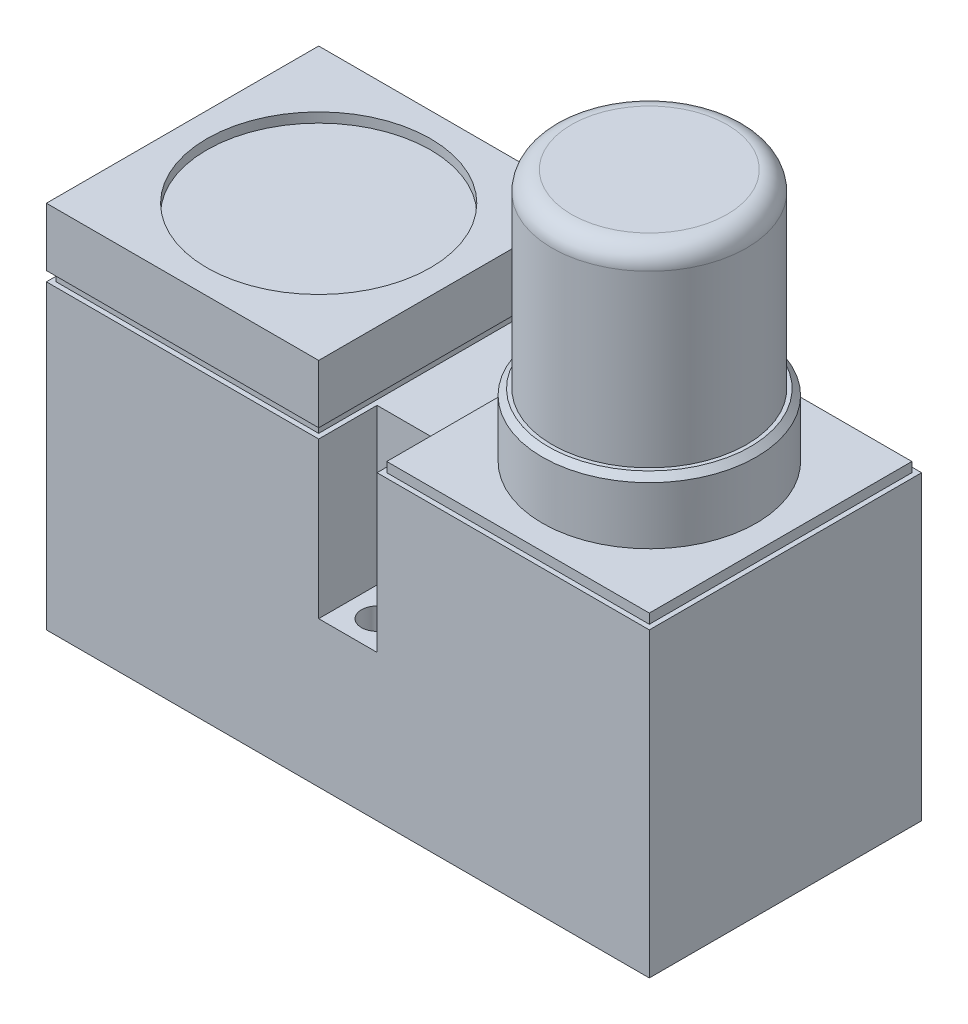
ISO-10303-21;
HEADER;
FILE_DESCRIPTION(('STEP AP214'),'2;1');
FILE_NAME('part.step','',(''),(''),'','','');
FILE_SCHEMA(('AUTOMOTIVE_DESIGN { 1 0 10303 214 1 1 1 1 }'));
ENDSEC;
DATA;
#1=APPLICATION_CONTEXT('core data for automotive mechanical design processes');
#2=APPLICATION_PROTOCOL_DEFINITION('international standard','automotive_design',2000,#1);
#3=PRODUCT_CONTEXT('',#1,'mechanical');
#4=PRODUCT('Part','Part','',(#3));
#5=PRODUCT_RELATED_PRODUCT_CATEGORY('part','',(#4));
#6=PRODUCT_DEFINITION_FORMATION('','',#4);
#7=PRODUCT_DEFINITION_CONTEXT('part definition',#1,'design');
#8=PRODUCT_DEFINITION('design','',#6,#7);
#9=PRODUCT_DEFINITION_SHAPE('','',#8);
#10=(LENGTH_UNIT() NAMED_UNIT(*) SI_UNIT(.MILLI.,.METRE.));
#11=(NAMED_UNIT(*) PLANE_ANGLE_UNIT() SI_UNIT($,.RADIAN.));
#12=(NAMED_UNIT(*) SI_UNIT($,.STERADIAN.) SOLID_ANGLE_UNIT());
#13=UNCERTAINTY_MEASURE_WITH_UNIT(LENGTH_MEASURE(1.E-05),#10,'distance_accuracy_value','');
#14=(GEOMETRIC_REPRESENTATION_CONTEXT(3) GLOBAL_UNCERTAINTY_ASSIGNED_CONTEXT((#13)) GLOBAL_UNIT_ASSIGNED_CONTEXT((#10,
#11,#12)) REPRESENTATION_CONTEXT('',''));
#15=CARTESIAN_POINT('',(0.,0.,0.));
#16=DIRECTION('',(0.,0.,1.));
#17=DIRECTION('',(1.,0.,0.));
#18=AXIS2_PLACEMENT_3D('',#15,#16,#17);
#19=CARTESIAN_POINT('',(-4.,51.,0.));
#20=DIRECTION('',(0.,1.,0.));
#21=DIRECTION('',(0.,0.,1.));
#22=AXIS2_PLACEMENT_3D('',#19,#20,#21);
#23=PLANE('',#22);
#24=CARTESIAN_POINT('',(0.,51.,0.));
#25=DIRECTION('',(0.,-1.,0.));
#26=DIRECTION('',(0.,0.,1.));
#27=AXIS2_PLACEMENT_3D('',#24,#25,#26);
#28=CIRCLE('',#27,8.);
#29=CARTESIAN_POINT('',(0.,51.,8.));
#30=VERTEX_POINT('',#29);
#31=CARTESIAN_POINT('',(-8.,51.,0.));
#32=VERTEX_POINT('',#31);
#33=EDGE_CURVE('E192',#30,#32,#28,.T.);
#34=ORIENTED_EDGE('',*,*,#33,.F.);
#35=CARTESIAN_POINT('',(0.,51.,0.));
#36=DIRECTION('',(0.,-1.,0.));
#37=DIRECTION('',(0.,0.,-1.));
#38=AXIS2_PLACEMENT_3D('',#35,#36,#37);
#39=CIRCLE('',#38,8.);
#40=CARTESIAN_POINT('',(0.,51.,-8.));
#41=VERTEX_POINT('',#40);
#42=EDGE_CURVE('E186',#41,#30,#39,.T.);
#43=ORIENTED_EDGE('',*,*,#42,.F.);
#44=CARTESIAN_POINT('',(0.,51.,0.));
#45=DIRECTION('',(0.,-1.,0.));
#46=DIRECTION('',(-1.,0.,0.));
#47=AXIS2_PLACEMENT_3D('',#44,#45,#46);
#48=CIRCLE('',#47,8.);
#49=EDGE_CURVE('E190',#32,#41,#48,.T.);
#50=ORIENTED_EDGE('',*,*,#49,.F.);
#51=EDGE_LOOP('',(#34,#43,#50));
#52=FACE_BOUND('',#51,.T.);
#53=ADVANCED_FACE('F16',(#52),#23,.T.);
#54=CARTESIAN_POINT('',(0.,49.,0.));
#55=DIRECTION('',(0.,-1.,0.));
#56=DIRECTION('',(0.,0.,-1.));
#57=AXIS2_PLACEMENT_3D('',#54,#55,#56);
#58=TOROIDAL_SURFACE('',#57,8.,2.);
#59=CARTESIAN_POINT('',(0.,49.,0.));
#60=DIRECTION('',(0.,1.,0.));
#61=DIRECTION('',(0.,0.,1.));
#62=AXIS2_PLACEMENT_3D('',#59,#60,#61);
#63=CIRCLE('',#62,10.);
#64=CARTESIAN_POINT('',(0.,49.,10.));
#65=VERTEX_POINT('',#64);
#66=EDGE_CURVE('E199',#65,#65,#63,.F.);
#67=ORIENTED_EDGE('',*,*,#66,.F.);
#68=EDGE_LOOP('',(#67));
#69=FACE_BOUND('',#68,.T.);
#70=ORIENTED_EDGE('',*,*,#33,.T.);
#71=ORIENTED_EDGE('',*,*,#49,.T.);
#72=ORIENTED_EDGE('',*,*,#42,.T.);
#73=EDGE_LOOP('',(#70,#71,#72));
#74=FACE_BOUND('',#73,.T.);
#75=ADVANCED_FACE('F197',(#69,#74),#58,.T.);
#76=CARTESIAN_POINT('',(0.,40.25,0.));
#77=DIRECTION('',(0.,1.,0.));
#78=DIRECTION('',(0.,0.,1.));
#79=AXIS2_PLACEMENT_3D('',#76,#77,#78);
#80=CYLINDRICAL_SURFACE('',#79,10.);
#81=CARTESIAN_POINT('',(0.,31.5,0.));
#82=DIRECTION('',(0.,1.,0.));
#83=DIRECTION('',(0.,0.,1.));
#84=AXIS2_PLACEMENT_3D('',#81,#82,#83);
#85=CIRCLE('',#84,10.);
#86=CARTESIAN_POINT('',(0.,31.5,10.));
#87=VERTEX_POINT('',#86);
#88=EDGE_CURVE('E226',#87,#87,#85,.F.);
#89=ORIENTED_EDGE('',*,*,#88,.F.);
#90=EDGE_LOOP('',(#89));
#91=FACE_BOUND('',#90,.T.);
#92=ORIENTED_EDGE('',*,*,#66,.T.);
#93=EDGE_LOOP('',(#92));
#94=FACE_BOUND('',#93,.T.);
#95=ADVANCED_FACE('F215',(#91,#94),#80,.T.);
#96=CARTESIAN_POINT('',(0.,30.,0.));
#97=DIRECTION('',(0.,1.,0.));
#98=DIRECTION('',(0.,0.,1.));
#99=AXIS2_PLACEMENT_3D('',#96,#97,#98);
#100=PLANE('',#99);
#101=CARTESIAN_POINT('',(-34.,30.,0.));
#102=DIRECTION('',(0.,1.,0.));
#103=DIRECTION('',(0.,0.,1.));
#104=AXIS2_PLACEMENT_3D('',#101,#102,#103);
#105=CIRCLE('',#104,11.5);
#106=CARTESIAN_POINT('',(-34.,30.,11.5));
#107=VERTEX_POINT('',#106);
#108=EDGE_CURVE('E245',#107,#107,#105,.T.);
#109=ORIENTED_EDGE('',*,*,#108,.T.);
#110=EDGE_LOOP('',(#109));
#111=FACE_BOUND('',#110,.T.);
#112=ADVANCED_FACE('F733',(#111),#100,.T.);
#113=CARTESIAN_POINT('',(-10.19325,31.5,0.));
#114=DIRECTION('',(0.,1.,0.));
#115=DIRECTION('',(0.,0.,1.));
#116=AXIS2_PLACEMENT_3D('',#113,#114,#115);
#117=PLANE('',#116);
#118=ORIENTED_EDGE('',*,*,#88,.T.);
#119=EDGE_LOOP('',(#118));
#120=FACE_BOUND('',#119,.T.);
#121=CARTESIAN_POINT('',(0.,31.5,0.));
#122=DIRECTION('',(0.,-1.,0.));
#123=DIRECTION('',(0.,0.,-1.));
#124=AXIS2_PLACEMENT_3D('',#121,#122,#123);
#125=CIRCLE('',#124,10.3865);
#126=CARTESIAN_POINT('',(0.,31.5,-10.3865));
#127=VERTEX_POINT('',#126);
#128=EDGE_CURVE('E250',#127,#127,#125,.T.);
#129=ORIENTED_EDGE('',*,*,#128,.F.);
#130=EDGE_LOOP('',(#129));
#131=FACE_BOUND('',#130,.T.);
#132=ADVANCED_FACE('F434',(#120,#131),#117,.T.);
#133=CARTESIAN_POINT('',(-34.,31.,0.));
#134=DIRECTION('',(0.,1.,0.));
#135=DIRECTION('',(0.,0.,1.));
#136=AXIS2_PLACEMENT_3D('',#133,#134,#135);
#137=CYLINDRICAL_SURFACE('',#136,11.5);
#138=CARTESIAN_POINT('',(-34.,31.,0.));
#139=DIRECTION('',(0.,1.,0.));
#140=DIRECTION('',(0.,0.,1.));
#141=AXIS2_PLACEMENT_3D('',#138,#139,#140);
#142=CIRCLE('',#141,11.5);
#143=CARTESIAN_POINT('',(-34.,31.,11.5));
#144=VERTEX_POINT('',#143);
#145=EDGE_CURVE('E255',#144,#144,#142,.F.);
#146=ORIENTED_EDGE('',*,*,#145,.F.);
#147=EDGE_LOOP('',(#146));
#148=FACE_BOUND('',#147,.T.);
#149=ORIENTED_EDGE('',*,*,#108,.F.);
#150=EDGE_LOOP('',(#149));
#151=FACE_BOUND('',#150,.T.);
#152=ADVANCED_FACE('F424',(#148,#151),#137,.F.);
#153=CARTESIAN_POINT('',(0.,30.8865,0.));
#154=DIRECTION('',(0.,-1.,0.));
#155=DIRECTION('',(0.,0.,-1.));
#156=AXIS2_PLACEMENT_3D('',#153,#154,#155);
#157=CONICAL_SURFACE('',#156,11.,0.785398163397448);
#158=ORIENTED_EDGE('',*,*,#128,.T.);
#159=EDGE_LOOP('',(#158));
#160=FACE_BOUND('',#159,.T.);
#161=CARTESIAN_POINT('',(0.,30.8865,0.));
#162=DIRECTION('',(0.,1.,0.));
#163=DIRECTION('',(0.,0.,1.));
#164=AXIS2_PLACEMENT_3D('',#161,#162,#163);
#165=CIRCLE('',#164,11.);
#166=CARTESIAN_POINT('',(0.,30.8865,11.));
#167=VERTEX_POINT('',#166);
#168=EDGE_CURVE('E223',#167,#167,#165,.F.);
#169=ORIENTED_EDGE('',*,*,#168,.F.);
#170=EDGE_LOOP('',(#169));
#171=FACE_BOUND('',#170,.T.);
#172=ADVANCED_FACE('F421',(#160,#171),#157,.T.);
#173=CARTESIAN_POINT('',(0.,31.,0.));
#174=DIRECTION('',(0.,1.,0.));
#175=DIRECTION('',(0.,0.,1.));
#176=AXIS2_PLACEMENT_3D('',#173,#174,#175);
#177=PLANE('',#176);
#178=DIRECTION('',(1.,0.,0.));
#179=VECTOR('',#178,1.);
#180=CARTESIAN_POINT('',(-20.,31.,14.));
#181=LINE('',#180,#179);
#182=CARTESIAN_POINT('',(-20.,31.,14.));
#183=VERTEX_POINT('',#182);
#184=CARTESIAN_POINT('',(-48.,31.,14.));
#185=VERTEX_POINT('',#184);
#186=EDGE_CURVE('E411',#183,#185,#181,.F.);
#187=ORIENTED_EDGE('',*,*,#186,.F.);
#188=DIRECTION('',(0.,0.,-1.));
#189=VECTOR('',#188,1.);
#190=CARTESIAN_POINT('',(-20.,31.,-14.));
#191=LINE('',#190,#189);
#192=CARTESIAN_POINT('',(-20.,31.,-14.));
#193=VERTEX_POINT('',#192);
#194=EDGE_CURVE('E409',#193,#183,#191,.F.);
#195=ORIENTED_EDGE('',*,*,#194,.F.);
#196=DIRECTION('',(-1.,0.,0.));
#197=VECTOR('',#196,1.);
#198=CARTESIAN_POINT('',(-48.,31.,-14.));
#199=LINE('',#198,#197);
#200=CARTESIAN_POINT('',(-48.,31.,-14.));
#201=VERTEX_POINT('',#200);
#202=EDGE_CURVE('E403',#201,#193,#199,.F.);
#203=ORIENTED_EDGE('',*,*,#202,.F.);
#204=DIRECTION('',(0.,0.,1.));
#205=VECTOR('',#204,1.);
#206=CARTESIAN_POINT('',(-48.,31.,14.));
#207=LINE('',#206,#205);
#208=EDGE_CURVE('E397',#185,#201,#207,.F.);
#209=ORIENTED_EDGE('',*,*,#208,.F.);
#210=EDGE_LOOP('',(#187,#195,#203,#209));
#211=FACE_BOUND('',#210,.T.);
#212=ORIENTED_EDGE('',*,*,#145,.T.);
#213=EDGE_LOOP('',(#212));
#214=FACE_BOUND('',#213,.T.);
#215=ADVANCED_FACE('F423',(#211,#214),#177,.T.);
#216=CARTESIAN_POINT('',(0.,26.94325,0.));
#217=DIRECTION('',(0.,1.,0.));
#218=DIRECTION('',(0.,0.,1.));
#219=AXIS2_PLACEMENT_3D('',#216,#217,#218);
#220=CYLINDRICAL_SURFACE('',#219,11.);
#221=ORIENTED_EDGE('',*,*,#168,.T.);
#222=EDGE_LOOP('',(#221));
#223=FACE_BOUND('',#222,.T.);
#224=CARTESIAN_POINT('',(0.,25.,0.));
#225=DIRECTION('',(0.,1.,0.));
#226=DIRECTION('',(0.,0.,1.));
#227=AXIS2_PLACEMENT_3D('',#224,#225,#226);
#228=CIRCLE('',#227,11.);
#229=CARTESIAN_POINT('',(0.,25.,11.));
#230=VERTEX_POINT('',#229);
#231=EDGE_CURVE('E258',#230,#230,#228,.F.);
#232=ORIENTED_EDGE('',*,*,#231,.F.);
#233=EDGE_LOOP('',(#232));
#234=FACE_BOUND('',#233,.T.);
#235=ADVANCED_FACE('F418',(#223,#234),#220,.T.);
#236=CARTESIAN_POINT('',(-20.,25.,14.));
#237=DIRECTION('',(0.,0.,1.));
#238=DIRECTION('',(1.,0.,0.));
#239=AXIS2_PLACEMENT_3D('',#236,#237,#238);
#240=PLANE('',#239);
#241=DIRECTION('',(1.,0.,0.));
#242=VECTOR('',#241,1.);
#243=CARTESIAN_POINT('',(0.,25.,14.));
#244=LINE('',#243,#242);
#245=CARTESIAN_POINT('',(-48.,25.,14.));
#246=VERTEX_POINT('',#245);
#247=CARTESIAN_POINT('',(-20.,25.,14.));
#248=VERTEX_POINT('',#247);
#249=EDGE_CURVE('E261',#246,#248,#244,.T.);
#250=ORIENTED_EDGE('',*,*,#249,.T.);
#251=DIRECTION('',(0.,1.,0.));
#252=VECTOR('',#251,1.);
#253=CARTESIAN_POINT('',(-20.,25.,14.));
#254=LINE('',#253,#252);
#255=EDGE_CURVE('E406',#183,#248,#254,.F.);
#256=ORIENTED_EDGE('',*,*,#255,.F.);
#257=ORIENTED_EDGE('',*,*,#186,.T.);
#258=DIRECTION('',(0.,1.,0.));
#259=VECTOR('',#258,1.);
#260=CARTESIAN_POINT('',(-48.,25.,14.));
#261=LINE('',#260,#259);
#262=EDGE_CURVE('E262',#246,#185,#261,.T.);
#263=ORIENTED_EDGE('',*,*,#262,.F.);
#264=EDGE_LOOP('',(#250,#256,#257,#263));
#265=FACE_BOUND('',#264,.T.);
#266=ADVANCED_FACE('F570',(#265),#240,.T.);
#267=CARTESIAN_POINT('',(-20.,25.,-14.));
#268=DIRECTION('',(1.,0.,0.));
#269=DIRECTION('',(0.,0.,-1.));
#270=AXIS2_PLACEMENT_3D('',#267,#268,#269);
#271=PLANE('',#270);
#272=DIRECTION('',(0.,0.,1.));
#273=VECTOR('',#272,1.);
#274=CARTESIAN_POINT('',(-20.,25.,0.));
#275=LINE('',#274,#273);
#276=CARTESIAN_POINT('',(-20.,25.,-14.));
#277=VERTEX_POINT('',#276);
#278=EDGE_CURVE('E389',#248,#277,#275,.F.);
#279=ORIENTED_EDGE('',*,*,#278,.T.);
#280=DIRECTION('',(0.,1.,0.));
#281=VECTOR('',#280,1.);
#282=CARTESIAN_POINT('',(-20.,25.,-14.));
#283=LINE('',#282,#281);
#284=EDGE_CURVE('E400',#193,#277,#283,.F.);
#285=ORIENTED_EDGE('',*,*,#284,.F.);
#286=ORIENTED_EDGE('',*,*,#194,.T.);
#287=ORIENTED_EDGE('',*,*,#255,.T.);
#288=EDGE_LOOP('',(#279,#285,#286,#287));
#289=FACE_BOUND('',#288,.T.);
#290=ADVANCED_FACE('F566',(#289),#271,.T.);
#291=CARTESIAN_POINT('',(-48.,25.,-14.));
#292=DIRECTION('',(0.,0.,-1.));
#293=DIRECTION('',(-1.,0.,0.));
#294=AXIS2_PLACEMENT_3D('',#291,#292,#293);
#295=PLANE('',#294);
#296=DIRECTION('',(1.,0.,0.));
#297=VECTOR('',#296,1.);
#298=CARTESIAN_POINT('',(0.,25.,-14.));
#299=LINE('',#298,#297);
#300=CARTESIAN_POINT('',(-48.,25.,-14.));
#301=VERTEX_POINT('',#300);
#302=EDGE_CURVE('E387',#277,#301,#299,.F.);
#303=ORIENTED_EDGE('',*,*,#302,.T.);
#304=DIRECTION('',(0.,1.,0.));
#305=VECTOR('',#304,1.);
#306=CARTESIAN_POINT('',(-48.,25.,-14.));
#307=LINE('',#306,#305);
#308=EDGE_CURVE('E394',#201,#301,#307,.F.);
#309=ORIENTED_EDGE('',*,*,#308,.F.);
#310=ORIENTED_EDGE('',*,*,#202,.T.);
#311=ORIENTED_EDGE('',*,*,#284,.T.);
#312=EDGE_LOOP('',(#303,#309,#310,#311));
#313=FACE_BOUND('',#312,.T.);
#314=ADVANCED_FACE('F562',(#313),#295,.T.);
#315=CARTESIAN_POINT('',(-48.,25.,14.));
#316=DIRECTION('',(-1.,0.,0.));
#317=DIRECTION('',(0.,0.,1.));
#318=AXIS2_PLACEMENT_3D('',#315,#316,#317);
#319=PLANE('',#318);
#320=DIRECTION('',(0.,0.,1.));
#321=VECTOR('',#320,1.);
#322=CARTESIAN_POINT('',(-48.,25.,0.));
#323=LINE('',#322,#321);
#324=EDGE_CURVE('E267',#301,#246,#323,.T.);
#325=ORIENTED_EDGE('',*,*,#324,.T.);
#326=ORIENTED_EDGE('',*,*,#262,.T.);
#327=ORIENTED_EDGE('',*,*,#208,.T.);
#328=ORIENTED_EDGE('',*,*,#308,.T.);
#329=EDGE_LOOP('',(#325,#326,#327,#328));
#330=FACE_BOUND('',#329,.T.);
#331=ADVANCED_FACE('F558',(#330),#319,.T.);
#332=CARTESIAN_POINT('',(0.,-12.,0.));
#333=DIRECTION('',(0.,1.,0.));
#334=DIRECTION('',(0.,0.,1.));
#335=AXIS2_PLACEMENT_3D('',#332,#333,#334);
#336=PLANE('',#335);
#337=CARTESIAN_POINT('',(-17.,-12.,4.5));
#338=DIRECTION('',(0.,1.,0.));
#339=DIRECTION('',(0.,0.,1.));
#340=AXIS2_PLACEMENT_3D('',#337,#338,#339);
#341=CIRCLE('',#340,2.);
#342=CARTESIAN_POINT('',(-17.,-12.,6.5));
#343=VERTEX_POINT('',#342);
#344=EDGE_CURVE('E263',#343,#343,#341,.T.);
#345=ORIENTED_EDGE('',*,*,#344,.F.);
#346=EDGE_LOOP('',(#345));
#347=FACE_BOUND('',#346,.T.);
#348=ADVANCED_FACE('F554',(#347),#336,.F.);
#349=CARTESIAN_POINT('',(0.,-12.,0.));
#350=DIRECTION('',(0.,1.,0.));
#351=DIRECTION('',(0.,0.,1.));
#352=AXIS2_PLACEMENT_3D('',#349,#350,#351);
#353=PLANE('',#352);
#354=CARTESIAN_POINT('',(-17.,-12.,-4.5));
#355=DIRECTION('',(0.,1.,0.));
#356=DIRECTION('',(0.,0.,1.));
#357=AXIS2_PLACEMENT_3D('',#354,#355,#356);
#358=CIRCLE('',#357,2.);
#359=CARTESIAN_POINT('',(-17.,-12.,-2.5));
#360=VERTEX_POINT('',#359);
#361=EDGE_CURVE('E266',#360,#360,#358,.T.);
#362=ORIENTED_EDGE('',*,*,#361,.F.);
#363=EDGE_LOOP('',(#362));
#364=FACE_BOUND('',#363,.T.);
#365=ADVANCED_FACE('F550',(#364),#353,.F.);
#366=CARTESIAN_POINT('',(0.,25.,0.));
#367=DIRECTION('',(0.,1.,0.));
#368=DIRECTION('',(0.,0.,1.));
#369=AXIS2_PLACEMENT_3D('',#366,#367,#368);
#370=PLANE('',#369);
#371=DIRECTION('',(1.,0.,0.));
#372=VECTOR('',#371,1.);
#373=CARTESIAN_POINT('',(13.5,25.,13.5));
#374=LINE('',#373,#372);
#375=CARTESIAN_POINT('',(13.5,25.,13.5));
#376=VERTEX_POINT('',#375);
#377=CARTESIAN_POINT('',(-13.5,25.,13.5));
#378=VERTEX_POINT('',#377);
#379=EDGE_CURVE('E374',#376,#378,#374,.F.);
#380=ORIENTED_EDGE('',*,*,#379,.F.);
#381=DIRECTION('',(0.,0.,-1.));
#382=VECTOR('',#381,1.);
#383=CARTESIAN_POINT('',(13.5,25.,-13.5));
#384=LINE('',#383,#382);
#385=CARTESIAN_POINT('',(13.5,25.,-13.5));
#386=VERTEX_POINT('',#385);
#387=EDGE_CURVE('E380',#386,#376,#384,.F.);
#388=ORIENTED_EDGE('',*,*,#387,.F.);
#389=DIRECTION('',(-1.,0.,0.));
#390=VECTOR('',#389,1.);
#391=CARTESIAN_POINT('',(-13.5,25.,-13.5));
#392=LINE('',#391,#390);
#393=CARTESIAN_POINT('',(-13.5,25.,-13.5));
#394=VERTEX_POINT('',#393);
#395=EDGE_CURVE('E273',#394,#386,#392,.F.);
#396=ORIENTED_EDGE('',*,*,#395,.F.);
#397=DIRECTION('',(0.,0.,1.));
#398=VECTOR('',#397,1.);
#399=CARTESIAN_POINT('',(-13.5,25.,13.5));
#400=LINE('',#399,#398);
#401=EDGE_CURVE('E368',#378,#394,#400,.F.);
#402=ORIENTED_EDGE('',*,*,#401,.F.);
#403=EDGE_LOOP('',(#380,#388,#396,#402));
#404=FACE_BOUND('',#403,.T.);
#405=ORIENTED_EDGE('',*,*,#231,.T.);
#406=EDGE_LOOP('',(#405));
#407=FACE_BOUND('',#406,.T.);
#408=ADVANCED_FACE('F546',(#404,#407),#370,.T.);
#409=CARTESIAN_POINT('',(0.,25.,0.));
#410=DIRECTION('',(0.,1.,0.));
#411=DIRECTION('',(0.,0.,1.));
#412=AXIS2_PLACEMENT_3D('',#409,#410,#411);
#413=PLANE('',#412);
#414=DIRECTION('',(0.,0.,1.));
#415=VECTOR('',#414,1.);
#416=CARTESIAN_POINT('',(-47.5,25.,13.5));
#417=LINE('',#416,#415);
#418=CARTESIAN_POINT('',(-47.5,25.,13.5));
#419=VERTEX_POINT('',#418);
#420=CARTESIAN_POINT('',(-47.5,25.,-13.5));
#421=VERTEX_POINT('',#420);
#422=EDGE_CURVE('E344',#419,#421,#417,.F.);
#423=ORIENTED_EDGE('',*,*,#422,.F.);
#424=DIRECTION('',(1.,0.,0.));
#425=VECTOR('',#424,1.);
#426=CARTESIAN_POINT('',(-20.5,25.,13.5));
#427=LINE('',#426,#425);
#428=CARTESIAN_POINT('',(-20.5,25.,13.5));
#429=VERTEX_POINT('',#428);
#430=EDGE_CURVE('E350',#429,#419,#427,.F.);
#431=ORIENTED_EDGE('',*,*,#430,.F.);
#432=DIRECTION('',(0.,0.,-1.));
#433=VECTOR('',#432,1.);
#434=CARTESIAN_POINT('',(-20.5,25.,-13.5));
#435=LINE('',#434,#433);
#436=CARTESIAN_POINT('',(-20.5,25.,-13.5));
#437=VERTEX_POINT('',#436);
#438=EDGE_CURVE('E356',#437,#429,#435,.F.);
#439=ORIENTED_EDGE('',*,*,#438,.F.);
#440=DIRECTION('',(-1.,0.,0.));
#441=VECTOR('',#440,1.);
#442=CARTESIAN_POINT('',(-47.5,25.,-13.5));
#443=LINE('',#442,#441);
#444=EDGE_CURVE('E359',#421,#437,#443,.F.);
#445=ORIENTED_EDGE('',*,*,#444,.F.);
#446=EDGE_LOOP('',(#423,#431,#439,#445));
#447=FACE_BOUND('',#446,.T.);
#448=ORIENTED_EDGE('',*,*,#302,.F.);
#449=ORIENTED_EDGE('',*,*,#278,.F.);
#450=ORIENTED_EDGE('',*,*,#249,.F.);
#451=ORIENTED_EDGE('',*,*,#324,.F.);
#452=EDGE_LOOP('',(#448,#449,#450,#451));
#453=FACE_BOUND('',#452,.T.);
#454=ADVANCED_FACE('F542',(#447,#453),#413,.F.);
#455=CARTESIAN_POINT('',(-20.,8.,-8.));
#456=DIRECTION('',(0.,-1.,0.));
#457=DIRECTION('',(0.,0.,-1.));
#458=AXIS2_PLACEMENT_3D('',#455,#456,#457);
#459=PLANE('',#458);
#460=DIRECTION('',(0.,0.,1.));
#461=VECTOR('',#460,1.);
#462=CARTESIAN_POINT('',(-20.,8.,-8.));
#463=LINE('',#462,#461);
#464=CARTESIAN_POINT('',(-20.,8.,-14.));
#465=VERTEX_POINT('',#464);
#466=CARTESIAN_POINT('',(-20.,8.,-8.));
#467=VERTEX_POINT('',#466);
#468=EDGE_CURVE('E330',#465,#467,#463,.T.);
#469=ORIENTED_EDGE('',*,*,#468,.T.);
#470=DIRECTION('',(1.,0.,0.));
#471=VECTOR('',#470,1.);
#472=CARTESIAN_POINT('',(0.,8.,-8.));
#473=LINE('',#472,#471);
#474=CARTESIAN_POINT('',(-14.,8.,-8.));
#475=VERTEX_POINT('',#474);
#476=EDGE_CURVE('E334',#467,#475,#473,.T.);
#477=ORIENTED_EDGE('',*,*,#476,.T.);
#478=DIRECTION('',(0.,0.,-1.));
#479=VECTOR('',#478,1.);
#480=CARTESIAN_POINT('',(-14.,8.,-8.));
#481=LINE('',#480,#479);
#482=CARTESIAN_POINT('',(-14.,8.,-14.));
#483=VERTEX_POINT('',#482);
#484=EDGE_CURVE('E336',#475,#483,#481,.T.);
#485=ORIENTED_EDGE('',*,*,#484,.T.);
#486=DIRECTION('',(1.,0.,0.));
#487=VECTOR('',#486,1.);
#488=CARTESIAN_POINT('',(0.,8.,-14.));
#489=LINE('',#488,#487);
#490=EDGE_CURVE('E326',#483,#465,#489,.F.);
#491=ORIENTED_EDGE('',*,*,#490,.T.);
#492=EDGE_LOOP('',(#469,#477,#485,#491));
#493=FACE_BOUND('',#492,.T.);
#494=CARTESIAN_POINT('',(-17.,8.,-11.));
#495=DIRECTION('',(0.,1.,0.));
#496=DIRECTION('',(0.,0.,1.));
#497=AXIS2_PLACEMENT_3D('',#494,#495,#496);
#498=CIRCLE('',#497,1.6);
#499=CARTESIAN_POINT('',(-17.,8.,-9.4));
#500=VERTEX_POINT('',#499);
#501=EDGE_CURVE('E270',#500,#500,#498,.F.);
#502=ORIENTED_EDGE('',*,*,#501,.T.);
#503=EDGE_LOOP('',(#502));
#504=FACE_BOUND('',#503,.T.);
#505=ADVANCED_FACE('F538',(#493,#504),#459,.F.);
#506=CARTESIAN_POINT('',(-17.,-2.,4.5));
#507=DIRECTION('',(0.,1.,0.));
#508=DIRECTION('',(0.,0.,1.));
#509=AXIS2_PLACEMENT_3D('',#506,#507,#508);
#510=CYLINDRICAL_SURFACE('',#509,2.);
#511=ORIENTED_EDGE('',*,*,#344,.T.);
#512=EDGE_LOOP('',(#511));
#513=FACE_BOUND('',#512,.T.);
#514=CARTESIAN_POINT('',(-17.,-7.,4.5));
#515=DIRECTION('',(0.,1.,0.));
#516=DIRECTION('',(0.,0.,1.));
#517=AXIS2_PLACEMENT_3D('',#514,#515,#516);
#518=CIRCLE('',#517,2.);
#519=CARTESIAN_POINT('',(-17.,-7.,6.5));
#520=VERTEX_POINT('',#519);
#521=EDGE_CURVE('E279',#520,#520,#518,.T.);
#522=ORIENTED_EDGE('',*,*,#521,.F.);
#523=EDGE_LOOP('',(#522));
#524=FACE_BOUND('',#523,.T.);
#525=ADVANCED_FACE('F534',(#513,#524),#510,.T.);
#526=CARTESIAN_POINT('',(-17.,-2.,-4.5));
#527=DIRECTION('',(0.,1.,0.));
#528=DIRECTION('',(0.,0.,1.));
#529=AXIS2_PLACEMENT_3D('',#526,#527,#528);
#530=CYLINDRICAL_SURFACE('',#529,2.);
#531=ORIENTED_EDGE('',*,*,#361,.T.);
#532=EDGE_LOOP('',(#531));
#533=FACE_BOUND('',#532,.T.);
#534=CARTESIAN_POINT('',(-17.,-7.,-4.5));
#535=DIRECTION('',(0.,1.,0.));
#536=DIRECTION('',(0.,0.,1.));
#537=AXIS2_PLACEMENT_3D('',#534,#535,#536);
#538=CIRCLE('',#537,2.);
#539=CARTESIAN_POINT('',(-17.,-7.,-2.5));
#540=VERTEX_POINT('',#539);
#541=EDGE_CURVE('E282',#540,#540,#538,.T.);
#542=ORIENTED_EDGE('',*,*,#541,.F.);
#543=EDGE_LOOP('',(#542));
#544=FACE_BOUND('',#543,.T.);
#545=ADVANCED_FACE('F530',(#533,#544),#530,.T.);
#546=CARTESIAN_POINT('',(-17.,9.,11.));
#547=DIRECTION('',(0.,1.,0.));
#548=DIRECTION('',(0.,0.,1.));
#549=AXIS2_PLACEMENT_3D('',#546,#547,#548);
#550=CYLINDRICAL_SURFACE('',#549,1.6);
#551=CARTESIAN_POINT('',(-17.,8.,11.));
#552=DIRECTION('',(0.,1.,0.));
#553=DIRECTION('',(0.,0.,1.));
#554=AXIS2_PLACEMENT_3D('',#551,#552,#553);
#555=CIRCLE('',#554,1.6);
#556=CARTESIAN_POINT('',(-17.,8.,12.6));
#557=VERTEX_POINT('',#556);
#558=EDGE_CURVE('E274',#557,#557,#555,.T.);
#559=ORIENTED_EDGE('',*,*,#558,.T.);
#560=EDGE_LOOP('',(#559));
#561=FACE_BOUND('',#560,.T.);
#562=CARTESIAN_POINT('',(-17.,-7.,11.));
#563=DIRECTION('',(0.,1.,0.));
#564=DIRECTION('',(0.,0.,1.));
#565=AXIS2_PLACEMENT_3D('',#562,#563,#564);
#566=CIRCLE('',#565,1.6);
#567=CARTESIAN_POINT('',(-17.,-7.,12.6));
#568=VERTEX_POINT('',#567);
#569=EDGE_CURVE('E286',#568,#568,#566,.T.);
#570=ORIENTED_EDGE('',*,*,#569,.F.);
#571=EDGE_LOOP('',(#570));
#572=FACE_BOUND('',#571,.T.);
#573=ADVANCED_FACE('F526',(#561,#572),#550,.F.);
#574=CARTESIAN_POINT('',(-17.,9.,-11.));
#575=DIRECTION('',(0.,1.,0.));
#576=DIRECTION('',(0.,0.,1.));
#577=AXIS2_PLACEMENT_3D('',#574,#575,#576);
#578=CYLINDRICAL_SURFACE('',#577,1.6);
#579=ORIENTED_EDGE('',*,*,#501,.F.);
#580=EDGE_LOOP('',(#579));
#581=FACE_BOUND('',#580,.T.);
#582=CARTESIAN_POINT('',(-17.,-7.,-11.));
#583=DIRECTION('',(0.,1.,0.));
#584=DIRECTION('',(0.,0.,1.));
#585=AXIS2_PLACEMENT_3D('',#582,#583,#584);
#586=CIRCLE('',#585,1.6);
#587=CARTESIAN_POINT('',(-17.,-7.,-9.4));
#588=VERTEX_POINT('',#587);
#589=EDGE_CURVE('E289',#588,#588,#586,.T.);
#590=ORIENTED_EDGE('',*,*,#589,.F.);
#591=EDGE_LOOP('',(#590));
#592=FACE_BOUND('',#591,.T.);
#593=ADVANCED_FACE('F522',(#581,#592),#578,.F.);
#594=CARTESIAN_POINT('',(-13.5,24.,-13.5));
#595=DIRECTION('',(0.,0.,-1.));
#596=DIRECTION('',(-1.,0.,0.));
#597=AXIS2_PLACEMENT_3D('',#594,#595,#596);
#598=PLANE('',#597);
#599=DIRECTION('',(1.,0.,0.));
#600=VECTOR('',#599,1.);
#601=CARTESIAN_POINT('',(14.,24.,-13.5));
#602=LINE('',#601,#600);
#603=CARTESIAN_POINT('',(-13.5,24.,-13.5));
#604=VERTEX_POINT('',#603);
#605=CARTESIAN_POINT('',(13.5,24.,-13.5));
#606=VERTEX_POINT('',#605);
#607=EDGE_CURVE('E791',#604,#606,#602,.T.);
#608=ORIENTED_EDGE('',*,*,#607,.F.);
#609=DIRECTION('',(0.,1.,0.));
#610=VECTOR('',#609,1.);
#611=CARTESIAN_POINT('',(-13.5,24.,-13.5));
#612=LINE('',#611,#610);
#613=EDGE_CURVE('E365',#394,#604,#612,.F.);
#614=ORIENTED_EDGE('',*,*,#613,.F.);
#615=ORIENTED_EDGE('',*,*,#395,.T.);
#616=DIRECTION('',(0.,1.,0.));
#617=VECTOR('',#616,1.);
#618=CARTESIAN_POINT('',(13.5,24.,-13.5));
#619=LINE('',#618,#617);
#620=EDGE_CURVE('E377',#606,#386,#619,.T.);
#621=ORIENTED_EDGE('',*,*,#620,.F.);
#622=EDGE_LOOP('',(#608,#614,#615,#621));
#623=FACE_BOUND('',#622,.T.);
#624=ADVANCED_FACE('F518',(#623),#598,.T.);
#625=CARTESIAN_POINT('',(13.5,24.,-13.5));
#626=DIRECTION('',(1.,0.,0.));
#627=DIRECTION('',(0.,0.,-1.));
#628=AXIS2_PLACEMENT_3D('',#625,#626,#627);
#629=PLANE('',#628);
#630=DIRECTION('',(0.,0.,1.));
#631=VECTOR('',#630,1.);
#632=CARTESIAN_POINT('',(13.5,24.,14.));
#633=LINE('',#632,#631);
#634=CARTESIAN_POINT('',(13.5,24.,13.5));
#635=VERTEX_POINT('',#634);
#636=EDGE_CURVE('E788',#606,#635,#633,.T.);
#637=ORIENTED_EDGE('',*,*,#636,.F.);
#638=ORIENTED_EDGE('',*,*,#620,.T.);
#639=ORIENTED_EDGE('',*,*,#387,.T.);
#640=DIRECTION('',(0.,1.,0.));
#641=VECTOR('',#640,1.);
#642=CARTESIAN_POINT('',(13.5,24.,13.5));
#643=LINE('',#642,#641);
#644=EDGE_CURVE('E371',#635,#376,#643,.T.);
#645=ORIENTED_EDGE('',*,*,#644,.F.);
#646=EDGE_LOOP('',(#637,#638,#639,#645));
#647=FACE_BOUND('',#646,.T.);
#648=ADVANCED_FACE('F514',(#647),#629,.T.);
#649=CARTESIAN_POINT('',(13.5,24.,13.5));
#650=DIRECTION('',(0.,0.,1.));
#651=DIRECTION('',(1.,0.,0.));
#652=AXIS2_PLACEMENT_3D('',#649,#650,#651);
#653=PLANE('',#652);
#654=DIRECTION('',(1.,0.,0.));
#655=VECTOR('',#654,1.);
#656=CARTESIAN_POINT('',(14.,24.,13.5));
#657=LINE('',#656,#655);
#658=CARTESIAN_POINT('',(-13.5,24.,13.5));
#659=VERTEX_POINT('',#658);
#660=EDGE_CURVE('E782',#635,#659,#657,.F.);
#661=ORIENTED_EDGE('',*,*,#660,.F.);
#662=ORIENTED_EDGE('',*,*,#644,.T.);
#663=ORIENTED_EDGE('',*,*,#379,.T.);
#664=DIRECTION('',(0.,1.,0.));
#665=VECTOR('',#664,1.);
#666=CARTESIAN_POINT('',(-13.5,24.,13.5));
#667=LINE('',#666,#665);
#668=EDGE_CURVE('E362',#659,#378,#667,.T.);
#669=ORIENTED_EDGE('',*,*,#668,.F.);
#670=EDGE_LOOP('',(#661,#662,#663,#669));
#671=FACE_BOUND('',#670,.T.);
#672=ADVANCED_FACE('F510',(#671),#653,.T.);
#673=CARTESIAN_POINT('',(-13.5,24.,13.5));
#674=DIRECTION('',(-1.,0.,0.));
#675=DIRECTION('',(0.,0.,1.));
#676=AXIS2_PLACEMENT_3D('',#673,#674,#675);
#677=PLANE('',#676);
#678=DIRECTION('',(0.,0.,1.));
#679=VECTOR('',#678,1.);
#680=CARTESIAN_POINT('',(-13.5,24.,14.));
#681=LINE('',#680,#679);
#682=EDGE_CURVE('E787',#659,#604,#681,.F.);
#683=ORIENTED_EDGE('',*,*,#682,.F.);
#684=ORIENTED_EDGE('',*,*,#668,.T.);
#685=ORIENTED_EDGE('',*,*,#401,.T.);
#686=ORIENTED_EDGE('',*,*,#613,.T.);
#687=EDGE_LOOP('',(#683,#684,#685,#686));
#688=FACE_BOUND('',#687,.T.);
#689=ADVANCED_FACE('F506',(#688),#677,.T.);
#690=CARTESIAN_POINT('',(-47.5,24.,-13.5));
#691=DIRECTION('',(0.,0.,-1.));
#692=DIRECTION('',(-1.,0.,0.));
#693=AXIS2_PLACEMENT_3D('',#690,#691,#692);
#694=PLANE('',#693);
#695=DIRECTION('',(1.,0.,0.));
#696=VECTOR('',#695,1.);
#697=CARTESIAN_POINT('',(14.,24.,-13.5));
#698=LINE('',#697,#696);
#699=CARTESIAN_POINT('',(-47.5,24.,-13.5));
#700=VERTEX_POINT('',#699);
#701=CARTESIAN_POINT('',(-20.5,24.,-13.5));
#702=VERTEX_POINT('',#701);
#703=EDGE_CURVE('E840',#700,#702,#698,.T.);
#704=ORIENTED_EDGE('',*,*,#703,.F.);
#705=DIRECTION('',(0.,1.,0.));
#706=VECTOR('',#705,1.);
#707=CARTESIAN_POINT('',(-47.5,24.,-13.5));
#708=LINE('',#707,#706);
#709=EDGE_CURVE('E341',#421,#700,#708,.F.);
#710=ORIENTED_EDGE('',*,*,#709,.F.);
#711=ORIENTED_EDGE('',*,*,#444,.T.);
#712=DIRECTION('',(0.,1.,0.));
#713=VECTOR('',#712,1.);
#714=CARTESIAN_POINT('',(-20.5,24.,-13.5));
#715=LINE('',#714,#713);
#716=EDGE_CURVE('E353',#702,#437,#715,.T.);
#717=ORIENTED_EDGE('',*,*,#716,.F.);
#718=EDGE_LOOP('',(#704,#710,#711,#717));
#719=FACE_BOUND('',#718,.T.);
#720=ADVANCED_FACE('F502',(#719),#694,.T.);
#721=CARTESIAN_POINT('',(-20.5,24.,-13.5));
#722=DIRECTION('',(1.,0.,0.));
#723=DIRECTION('',(0.,0.,-1.));
#724=AXIS2_PLACEMENT_3D('',#721,#722,#723);
#725=PLANE('',#724);
#726=DIRECTION('',(0.,0.,1.));
#727=VECTOR('',#726,1.);
#728=CARTESIAN_POINT('',(-20.5,24.,14.));
#729=LINE('',#728,#727);
#730=CARTESIAN_POINT('',(-20.5,24.,13.5));
#731=VERTEX_POINT('',#730);
#732=EDGE_CURVE('E837',#702,#731,#729,.T.);
#733=ORIENTED_EDGE('',*,*,#732,.F.);
#734=ORIENTED_EDGE('',*,*,#716,.T.);
#735=ORIENTED_EDGE('',*,*,#438,.T.);
#736=DIRECTION('',(0.,1.,0.));
#737=VECTOR('',#736,1.);
#738=CARTESIAN_POINT('',(-20.5,24.,13.5));
#739=LINE('',#738,#737);
#740=EDGE_CURVE('E347',#731,#429,#739,.T.);
#741=ORIENTED_EDGE('',*,*,#740,.F.);
#742=EDGE_LOOP('',(#733,#734,#735,#741));
#743=FACE_BOUND('',#742,.T.);
#744=ADVANCED_FACE('F498',(#743),#725,.T.);
#745=CARTESIAN_POINT('',(-20.5,24.,13.5));
#746=DIRECTION('',(0.,0.,1.));
#747=DIRECTION('',(1.,0.,0.));
#748=AXIS2_PLACEMENT_3D('',#745,#746,#747);
#749=PLANE('',#748);
#750=DIRECTION('',(1.,0.,0.));
#751=VECTOR('',#750,1.);
#752=CARTESIAN_POINT('',(14.,24.,13.5));
#753=LINE('',#752,#751);
#754=CARTESIAN_POINT('',(-47.5,24.,13.5));
#755=VERTEX_POINT('',#754);
#756=EDGE_CURVE('E834',#731,#755,#753,.F.);
#757=ORIENTED_EDGE('',*,*,#756,.F.);
#758=ORIENTED_EDGE('',*,*,#740,.T.);
#759=ORIENTED_EDGE('',*,*,#430,.T.);
#760=DIRECTION('',(0.,1.,0.));
#761=VECTOR('',#760,1.);
#762=CARTESIAN_POINT('',(-47.5,24.,13.5));
#763=LINE('',#762,#761);
#764=EDGE_CURVE('E338',#755,#419,#763,.T.);
#765=ORIENTED_EDGE('',*,*,#764,.F.);
#766=EDGE_LOOP('',(#757,#758,#759,#765));
#767=FACE_BOUND('',#766,.T.);
#768=ADVANCED_FACE('F494',(#767),#749,.T.);
#769=CARTESIAN_POINT('',(-47.5,24.,13.5));
#770=DIRECTION('',(-1.,0.,0.));
#771=DIRECTION('',(0.,0.,1.));
#772=AXIS2_PLACEMENT_3D('',#769,#770,#771);
#773=PLANE('',#772);
#774=DIRECTION('',(0.,0.,1.));
#775=VECTOR('',#774,1.);
#776=CARTESIAN_POINT('',(-47.5,24.,14.));
#777=LINE('',#776,#775);
#778=EDGE_CURVE('E831',#755,#700,#777,.F.);
#779=ORIENTED_EDGE('',*,*,#778,.F.);
#780=ORIENTED_EDGE('',*,*,#764,.T.);
#781=ORIENTED_EDGE('',*,*,#422,.T.);
#782=ORIENTED_EDGE('',*,*,#709,.T.);
#783=EDGE_LOOP('',(#779,#780,#781,#782));
#784=FACE_BOUND('',#783,.T.);
#785=ADVANCED_FACE('F490',(#784),#773,.T.);
#786=CARTESIAN_POINT('',(-14.,8.,-8.));
#787=DIRECTION('',(1.,0.,0.));
#788=DIRECTION('',(0.,0.,-1.));
#789=AXIS2_PLACEMENT_3D('',#786,#787,#788);
#790=PLANE('',#789);
#791=ORIENTED_EDGE('',*,*,#484,.F.);
#792=DIRECTION('',(0.,1.,0.));
#793=VECTOR('',#792,1.);
#794=CARTESIAN_POINT('',(-14.,0.,-8.));
#795=LINE('',#794,#793);
#796=CARTESIAN_POINT('',(-14.,24.,-8.));
#797=VERTEX_POINT('',#796);
#798=EDGE_CURVE('E332',#475,#797,#795,.T.);
#799=ORIENTED_EDGE('',*,*,#798,.T.);
#800=DIRECTION('',(0.,0.,1.));
#801=VECTOR('',#800,1.);
#802=CARTESIAN_POINT('',(-14.,24.,14.));
#803=LINE('',#802,#801);
#804=CARTESIAN_POINT('',(-14.,24.,-14.));
#805=VERTEX_POINT('',#804);
#806=EDGE_CURVE('E829',#805,#797,#803,.T.);
#807=ORIENTED_EDGE('',*,*,#806,.F.);
#808=DIRECTION('',(0.,1.,0.));
#809=VECTOR('',#808,1.);
#810=CARTESIAN_POINT('',(-14.,0.,-14.));
#811=LINE('',#810,#809);
#812=EDGE_CURVE('E321',#805,#483,#811,.F.);
#813=ORIENTED_EDGE('',*,*,#812,.T.);
#814=EDGE_LOOP('',(#791,#799,#807,#813));
#815=FACE_BOUND('',#814,.T.);
#816=ADVANCED_FACE('F486',(#815),#790,.F.);
#817=CARTESIAN_POINT('',(0.,0.,-8.));
#818=DIRECTION('',(0.,0.,1.));
#819=DIRECTION('',(1.,0.,0.));
#820=AXIS2_PLACEMENT_3D('',#817,#818,#819);
#821=PLANE('',#820);
#822=ORIENTED_EDGE('',*,*,#798,.F.);
#823=ORIENTED_EDGE('',*,*,#476,.F.);
#824=DIRECTION('',(0.,1.,0.));
#825=VECTOR('',#824,1.);
#826=CARTESIAN_POINT('',(-20.,25.,-8.));
#827=LINE('',#826,#825);
#828=CARTESIAN_POINT('',(-20.,24.,-8.));
#829=VERTEX_POINT('',#828);
#830=EDGE_CURVE('E328',#467,#829,#827,.T.);
#831=ORIENTED_EDGE('',*,*,#830,.T.);
#832=DIRECTION('',(1.,0.,0.));
#833=VECTOR('',#832,1.);
#834=CARTESIAN_POINT('',(14.,24.,-8.));
#835=LINE('',#834,#833);
#836=EDGE_CURVE('E826',#797,#829,#835,.F.);
#837=ORIENTED_EDGE('',*,*,#836,.F.);
#838=EDGE_LOOP('',(#822,#823,#831,#837));
#839=FACE_BOUND('',#838,.T.);
#840=ADVANCED_FACE('F482',(#839),#821,.F.);
#841=CARTESIAN_POINT('',(-20.,25.,-8.));
#842=DIRECTION('',(-1.,0.,0.));
#843=DIRECTION('',(0.,0.,1.));
#844=AXIS2_PLACEMENT_3D('',#841,#842,#843);
#845=PLANE('',#844);
#846=DIRECTION('',(0.,0.,1.));
#847=VECTOR('',#846,1.);
#848=CARTESIAN_POINT('',(-20.,24.,14.));
#849=LINE('',#848,#847);
#850=CARTESIAN_POINT('',(-20.,24.,-14.));
#851=VERTEX_POINT('',#850);
#852=EDGE_CURVE('E823',#829,#851,#849,.F.);
#853=ORIENTED_EDGE('',*,*,#852,.F.);
#854=ORIENTED_EDGE('',*,*,#830,.F.);
#855=ORIENTED_EDGE('',*,*,#468,.F.);
#856=DIRECTION('',(0.,1.,0.));
#857=VECTOR('',#856,1.);
#858=CARTESIAN_POINT('',(-20.,0.,-14.));
#859=LINE('',#858,#857);
#860=EDGE_CURVE('E324',#465,#851,#859,.T.);
#861=ORIENTED_EDGE('',*,*,#860,.T.);
#862=EDGE_LOOP('',(#853,#854,#855,#861));
#863=FACE_BOUND('',#862,.T.);
#864=ADVANCED_FACE('F478',(#863),#845,.F.);
#865=CARTESIAN_POINT('',(0.,0.,8.));
#866=DIRECTION('',(0.,0.,1.));
#867=DIRECTION('',(1.,0.,0.));
#868=AXIS2_PLACEMENT_3D('',#865,#866,#867);
#869=PLANE('',#868);
#870=DIRECTION('',(1.,0.,0.));
#871=VECTOR('',#870,1.);
#872=CARTESIAN_POINT('',(-20.,8.,8.));
#873=LINE('',#872,#871);
#874=CARTESIAN_POINT('',(-20.,8.,8.));
#875=VERTEX_POINT('',#874);
#876=CARTESIAN_POINT('',(-14.,8.,8.));
#877=VERTEX_POINT('',#876);
#878=EDGE_CURVE('E277',#875,#877,#873,.T.);
#879=ORIENTED_EDGE('',*,*,#878,.T.);
#880=DIRECTION('',(0.,1.,0.));
#881=VECTOR('',#880,1.);
#882=CARTESIAN_POINT('',(-14.,8.,8.));
#883=LINE('',#882,#881);
#884=CARTESIAN_POINT('',(-14.,24.,8.));
#885=VERTEX_POINT('',#884);
#886=EDGE_CURVE('E278',#877,#885,#883,.T.);
#887=ORIENTED_EDGE('',*,*,#886,.T.);
#888=DIRECTION('',(1.,0.,0.));
#889=VECTOR('',#888,1.);
#890=CARTESIAN_POINT('',(14.,24.,8.));
#891=LINE('',#890,#889);
#892=CARTESIAN_POINT('',(-20.,24.,8.));
#893=VERTEX_POINT('',#892);
#894=EDGE_CURVE('E809',#893,#885,#891,.T.);
#895=ORIENTED_EDGE('',*,*,#894,.F.);
#896=DIRECTION('',(0.,1.,0.));
#897=VECTOR('',#896,1.);
#898=CARTESIAN_POINT('',(-20.,25.,8.));
#899=LINE('',#898,#897);
#900=EDGE_CURVE('E315',#893,#875,#899,.F.);
#901=ORIENTED_EDGE('',*,*,#900,.T.);
#902=EDGE_LOOP('',(#879,#887,#895,#901));
#903=FACE_BOUND('',#902,.T.);
#904=ADVANCED_FACE('F474',(#903),#869,.T.);
#905=CARTESIAN_POINT('',(0.,0.,-14.));
#906=DIRECTION('',(0.,0.,1.));
#907=DIRECTION('',(1.,0.,0.));
#908=AXIS2_PLACEMENT_3D('',#905,#906,#907);
#909=PLANE('',#908);
#910=DIRECTION('',(1.,0.,0.));
#911=VECTOR('',#910,1.);
#912=CARTESIAN_POINT('',(14.,24.,-14.));
#913=LINE('',#912,#911);
#914=CARTESIAN_POINT('',(14.,24.,-14.));
#915=VERTEX_POINT('',#914);
#916=EDGE_CURVE('E800',#915,#805,#913,.F.);
#917=ORIENTED_EDGE('',*,*,#916,.F.);
#918=DIRECTION('',(0.,1.,0.));
#919=VECTOR('',#918,1.);
#920=CARTESIAN_POINT('',(14.,-7.,-14.));
#921=LINE('',#920,#919);
#922=CARTESIAN_POINT('',(14.,-7.,-14.));
#923=VERTEX_POINT('',#922);
#924=EDGE_CURVE('E307',#923,#915,#921,.T.);
#925=ORIENTED_EDGE('',*,*,#924,.F.);
#926=DIRECTION('',(1.,0.,0.));
#927=VECTOR('',#926,1.);
#928=CARTESIAN_POINT('',(-48.,-7.,-14.));
#929=LINE('',#928,#927);
#930=CARTESIAN_POINT('',(-48.,-7.,-14.));
#931=VERTEX_POINT('',#930);
#932=EDGE_CURVE('E291',#931,#923,#929,.T.);
#933=ORIENTED_EDGE('',*,*,#932,.F.);
#934=DIRECTION('',(0.,1.,0.));
#935=VECTOR('',#934,1.);
#936=CARTESIAN_POINT('',(-48.,24.,-14.));
#937=LINE('',#936,#935);
#938=CARTESIAN_POINT('',(-48.,24.,-14.));
#939=VERTEX_POINT('',#938);
#940=EDGE_CURVE('E283',#939,#931,#937,.F.);
#941=ORIENTED_EDGE('',*,*,#940,.F.);
#942=DIRECTION('',(1.,0.,0.));
#943=VECTOR('',#942,1.);
#944=CARTESIAN_POINT('',(14.,24.,-14.));
#945=LINE('',#944,#943);
#946=EDGE_CURVE('E820',#851,#939,#945,.F.);
#947=ORIENTED_EDGE('',*,*,#946,.F.);
#948=ORIENTED_EDGE('',*,*,#860,.F.);
#949=ORIENTED_EDGE('',*,*,#490,.F.);
#950=ORIENTED_EDGE('',*,*,#812,.F.);
#951=EDGE_LOOP('',(#917,#925,#933,#941,#947,#948,#949,#950));
#952=FACE_BOUND('',#951,.T.);
#953=ADVANCED_FACE('F470',(#952),#909,.F.);
#954=CARTESIAN_POINT('',(-14.,8.,20.));
#955=DIRECTION('',(1.,0.,0.));
#956=DIRECTION('',(0.,0.,-1.));
#957=AXIS2_PLACEMENT_3D('',#954,#955,#956);
#958=PLANE('',#957);
#959=DIRECTION('',(0.,0.,1.));
#960=VECTOR('',#959,1.);
#961=CARTESIAN_POINT('',(-14.,24.,14.));
#962=LINE('',#961,#960);
#963=CARTESIAN_POINT('',(-14.,24.,14.));
#964=VERTEX_POINT('',#963);
#965=EDGE_CURVE('E807',#885,#964,#962,.T.);
#966=ORIENTED_EDGE('',*,*,#965,.F.);
#967=ORIENTED_EDGE('',*,*,#886,.F.);
#968=DIRECTION('',(0.,0.,-1.));
#969=VECTOR('',#968,1.);
#970=CARTESIAN_POINT('',(-14.,8.,20.));
#971=LINE('',#970,#969);
#972=CARTESIAN_POINT('',(-14.,8.,14.));
#973=VERTEX_POINT('',#972);
#974=EDGE_CURVE('E317',#877,#973,#971,.F.);
#975=ORIENTED_EDGE('',*,*,#974,.T.);
#976=DIRECTION('',(0.,1.,0.));
#977=VECTOR('',#976,1.);
#978=CARTESIAN_POINT('',(-14.,0.,14.));
#979=LINE('',#978,#977);
#980=EDGE_CURVE('E803',#964,#973,#979,.F.);
#981=ORIENTED_EDGE('',*,*,#980,.F.);
#982=EDGE_LOOP('',(#966,#967,#975,#981));
#983=FACE_BOUND('',#982,.T.);
#984=ADVANCED_FACE('F466',(#983),#958,.F.);
#985=CARTESIAN_POINT('',(-20.,8.,20.));
#986=DIRECTION('',(0.,-1.,0.));
#987=DIRECTION('',(0.,0.,-1.));
#988=AXIS2_PLACEMENT_3D('',#985,#986,#987);
#989=PLANE('',#988);
#990=ORIENTED_EDGE('',*,*,#974,.F.);
#991=ORIENTED_EDGE('',*,*,#878,.F.);
#992=DIRECTION('',(0.,0.,1.));
#993=VECTOR('',#992,1.);
#994=CARTESIAN_POINT('',(-20.,8.,20.));
#995=LINE('',#994,#993);
#996=CARTESIAN_POINT('',(-20.,8.,14.));
#997=VERTEX_POINT('',#996);
#998=EDGE_CURVE('E313',#875,#997,#995,.T.);
#999=ORIENTED_EDGE('',*,*,#998,.T.);
#1000=DIRECTION('',(1.,0.,0.));
#1001=VECTOR('',#1000,1.);
#1002=CARTESIAN_POINT('',(0.,8.,14.));
#1003=LINE('',#1002,#1001);
#1004=EDGE_CURVE('E872',#973,#997,#1003,.F.);
#1005=ORIENTED_EDGE('',*,*,#1004,.F.);
#1006=EDGE_LOOP('',(#990,#991,#999,#1005));
#1007=FACE_BOUND('',#1006,.T.);
#1008=ORIENTED_EDGE('',*,*,#558,.F.);
#1009=EDGE_LOOP('',(#1008));
#1010=FACE_BOUND('',#1009,.T.);
#1011=ADVANCED_FACE('F462',(#1007,#1010),#989,.F.);
#1012=CARTESIAN_POINT('',(-20.,25.,20.));
#1013=DIRECTION('',(-1.,0.,0.));
#1014=DIRECTION('',(0.,0.,1.));
#1015=AXIS2_PLACEMENT_3D('',#1012,#1013,#1014);
#1016=PLANE('',#1015);
#1017=ORIENTED_EDGE('',*,*,#998,.F.);
#1018=ORIENTED_EDGE('',*,*,#900,.F.);
#1019=DIRECTION('',(0.,0.,1.));
#1020=VECTOR('',#1019,1.);
#1021=CARTESIAN_POINT('',(-20.,24.,14.));
#1022=LINE('',#1021,#1020);
#1023=CARTESIAN_POINT('',(-20.,24.,14.));
#1024=VERTEX_POINT('',#1023);
#1025=EDGE_CURVE('E815',#1024,#893,#1022,.F.);
#1026=ORIENTED_EDGE('',*,*,#1025,.F.);
#1027=DIRECTION('',(0.,1.,0.));
#1028=VECTOR('',#1027,1.);
#1029=CARTESIAN_POINT('',(-20.,0.,14.));
#1030=LINE('',#1029,#1028);
#1031=EDGE_CURVE('E870',#997,#1024,#1030,.T.);
#1032=ORIENTED_EDGE('',*,*,#1031,.F.);
#1033=EDGE_LOOP('',(#1017,#1018,#1026,#1032));
#1034=FACE_BOUND('',#1033,.T.);
#1035=ADVANCED_FACE('F458',(#1034),#1016,.F.);
#1036=CARTESIAN_POINT('',(-48.,24.,14.));
#1037=DIRECTION('',(-1.,0.,0.));
#1038=DIRECTION('',(0.,0.,1.));
#1039=AXIS2_PLACEMENT_3D('',#1036,#1037,#1038);
#1040=PLANE('',#1039);
#1041=DIRECTION('',(0.,1.,0.));
#1042=VECTOR('',#1041,1.);
#1043=CARTESIAN_POINT('',(-48.,0.,14.));
#1044=LINE('',#1043,#1042);
#1045=CARTESIAN_POINT('',(-48.,24.,14.));
#1046=VERTEX_POINT('',#1045);
#1047=CARTESIAN_POINT('',(-48.,-7.,14.));
#1048=VERTEX_POINT('',#1047);
#1049=EDGE_CURVE('E860',#1046,#1048,#1044,.F.);
#1050=ORIENTED_EDGE('',*,*,#1049,.F.);
#1051=DIRECTION('',(0.,0.,1.));
#1052=VECTOR('',#1051,1.);
#1053=CARTESIAN_POINT('',(-48.,24.,14.));
#1054=LINE('',#1053,#1052);
#1055=EDGE_CURVE('E818',#939,#1046,#1054,.T.);
#1056=ORIENTED_EDGE('',*,*,#1055,.F.);
#1057=ORIENTED_EDGE('',*,*,#940,.T.);
#1058=DIRECTION('',(0.,0.,-1.));
#1059=VECTOR('',#1058,1.);
#1060=CARTESIAN_POINT('',(-48.,-7.,14.));
#1061=LINE('',#1060,#1059);
#1062=EDGE_CURVE('E302',#1048,#931,#1061,.T.);
#1063=ORIENTED_EDGE('',*,*,#1062,.F.);
#1064=EDGE_LOOP('',(#1050,#1056,#1057,#1063));
#1065=FACE_BOUND('',#1064,.T.);
#1066=ADVANCED_FACE('F455',(#1065),#1040,.T.);
#1067=CARTESIAN_POINT('',(-48.,-7.,14.));
#1068=DIRECTION('',(0.,-1.,0.));
#1069=DIRECTION('',(0.,0.,-1.));
#1070=AXIS2_PLACEMENT_3D('',#1067,#1068,#1069);
#1071=PLANE('',#1070);
#1072=DIRECTION('',(1.,0.,0.));
#1073=VECTOR('',#1072,1.);
#1074=CARTESIAN_POINT('',(0.,-7.,14.));
#1075=LINE('',#1074,#1073);
#1076=CARTESIAN_POINT('',(14.,-7.,14.));
#1077=VERTEX_POINT('',#1076);
#1078=EDGE_CURVE('E864',#1048,#1077,#1075,.T.);
#1079=ORIENTED_EDGE('',*,*,#1078,.F.);
#1080=ORIENTED_EDGE('',*,*,#1062,.T.);
#1081=ORIENTED_EDGE('',*,*,#932,.T.);
#1082=DIRECTION('',(0.,0.,1.));
#1083=VECTOR('',#1082,1.);
#1084=CARTESIAN_POINT('',(14.,-7.,14.));
#1085=LINE('',#1084,#1083);
#1086=EDGE_CURVE('E793',#1077,#923,#1085,.F.);
#1087=ORIENTED_EDGE('',*,*,#1086,.F.);
#1088=EDGE_LOOP('',(#1079,#1080,#1081,#1087));
#1089=FACE_BOUND('',#1088,.T.);
#1090=ORIENTED_EDGE('',*,*,#589,.T.);
#1091=EDGE_LOOP('',(#1090));
#1092=FACE_BOUND('',#1091,.T.);
#1093=ORIENTED_EDGE('',*,*,#569,.T.);
#1094=EDGE_LOOP('',(#1093));
#1095=FACE_BOUND('',#1094,.T.);
#1096=ORIENTED_EDGE('',*,*,#541,.T.);
#1097=EDGE_LOOP('',(#1096));
#1098=FACE_BOUND('',#1097,.T.);
#1099=ORIENTED_EDGE('',*,*,#521,.T.);
#1100=EDGE_LOOP('',(#1099));
#1101=FACE_BOUND('',#1100,.T.);
#1102=ADVANCED_FACE('F452',(#1089,#1092,#1095,#1098,#1101),#1071,.T.);
#1103=CARTESIAN_POINT('',(14.,-7.,14.));
#1104=DIRECTION('',(1.,0.,0.));
#1105=DIRECTION('',(0.,1.,0.));
#1106=AXIS2_PLACEMENT_3D('',#1103,#1104,#1105);
#1107=PLANE('',#1106);
#1108=DIRECTION('',(0.,1.,0.));
#1109=VECTOR('',#1108,1.);
#1110=CARTESIAN_POINT('',(14.,0.,14.));
#1111=LINE('',#1110,#1109);
#1112=CARTESIAN_POINT('',(14.,24.,14.));
#1113=VERTEX_POINT('',#1112);
#1114=EDGE_CURVE('E27',#1077,#1113,#1111,.T.);
#1115=ORIENTED_EDGE('',*,*,#1114,.F.);
#1116=ORIENTED_EDGE('',*,*,#1086,.T.);
#1117=ORIENTED_EDGE('',*,*,#924,.T.);
#1118=DIRECTION('',(0.,0.,1.));
#1119=VECTOR('',#1118,1.);
#1120=CARTESIAN_POINT('',(14.,24.,14.));
#1121=LINE('',#1120,#1119);
#1122=EDGE_CURVE('E36',#1113,#915,#1121,.F.);
#1123=ORIENTED_EDGE('',*,*,#1122,.F.);
#1124=EDGE_LOOP('',(#1115,#1116,#1117,#1123));
#1125=FACE_BOUND('',#1124,.T.);
#1126=ADVANCED_FACE('F445',(#1125),#1107,.T.);
#1127=CARTESIAN_POINT('',(14.,24.,14.));
#1128=DIRECTION('',(0.,1.,0.));
#1129=DIRECTION('',(0.,0.,1.));
#1130=AXIS2_PLACEMENT_3D('',#1127,#1128,#1129);
#1131=PLANE('',#1130);
#1132=ORIENTED_EDGE('',*,*,#1122,.T.);
#1133=ORIENTED_EDGE('',*,*,#916,.T.);
#1134=ORIENTED_EDGE('',*,*,#806,.T.);
#1135=ORIENTED_EDGE('',*,*,#836,.T.);
#1136=ORIENTED_EDGE('',*,*,#852,.T.);
#1137=ORIENTED_EDGE('',*,*,#946,.T.);
#1138=ORIENTED_EDGE('',*,*,#1055,.T.);
#1139=DIRECTION('',(1.,0.,0.));
#1140=VECTOR('',#1139,1.);
#1141=CARTESIAN_POINT('',(0.,24.,14.));
#1142=LINE('',#1141,#1140);
#1143=EDGE_CURVE('E865',#1024,#1046,#1142,.F.);
#1144=ORIENTED_EDGE('',*,*,#1143,.F.);
#1145=ORIENTED_EDGE('',*,*,#1025,.T.);
#1146=ORIENTED_EDGE('',*,*,#894,.T.);
#1147=ORIENTED_EDGE('',*,*,#965,.T.);
#1148=DIRECTION('',(1.,0.,0.));
#1149=VECTOR('',#1148,1.);
#1150=CARTESIAN_POINT('',(0.,24.,14.));
#1151=LINE('',#1150,#1149);
#1152=EDGE_CURVE('E11',#1113,#964,#1151,.F.);
#1153=ORIENTED_EDGE('',*,*,#1152,.F.);
#1154=EDGE_LOOP('',(#1132,#1133,#1134,#1135,#1136,#1137,#1138,#1144,#1145,#1146,#1147,#1153));
#1155=FACE_BOUND('',#1154,.T.);
#1156=ORIENTED_EDGE('',*,*,#756,.T.);
#1157=ORIENTED_EDGE('',*,*,#778,.T.);
#1158=ORIENTED_EDGE('',*,*,#703,.T.);
#1159=ORIENTED_EDGE('',*,*,#732,.T.);
#1160=EDGE_LOOP('',(#1156,#1157,#1158,#1159));
#1161=FACE_BOUND('',#1160,.T.);
#1162=ORIENTED_EDGE('',*,*,#660,.T.);
#1163=ORIENTED_EDGE('',*,*,#682,.T.);
#1164=ORIENTED_EDGE('',*,*,#607,.T.);
#1165=ORIENTED_EDGE('',*,*,#636,.T.);
#1166=EDGE_LOOP('',(#1162,#1163,#1164,#1165));
#1167=FACE_BOUND('',#1166,.T.);
#1168=ADVANCED_FACE('F439',(#1155,#1161,#1167),#1131,.T.);
#1169=CARTESIAN_POINT('',(0.,0.,14.));
#1170=DIRECTION('',(0.,0.,1.));
#1171=DIRECTION('',(1.,0.,0.));
#1172=AXIS2_PLACEMENT_3D('',#1169,#1170,#1171);
#1173=PLANE('',#1172);
#1174=ORIENTED_EDGE('',*,*,#1114,.T.);
#1175=ORIENTED_EDGE('',*,*,#1152,.T.);
#1176=ORIENTED_EDGE('',*,*,#980,.T.);
#1177=ORIENTED_EDGE('',*,*,#1004,.T.);
#1178=ORIENTED_EDGE('',*,*,#1031,.T.);
#1179=ORIENTED_EDGE('',*,*,#1143,.T.);
#1180=ORIENTED_EDGE('',*,*,#1049,.T.);
#1181=ORIENTED_EDGE('',*,*,#1078,.T.);
#1182=EDGE_LOOP('',(#1174,#1175,#1176,#1177,#1178,#1179,#1180,#1181));
#1183=FACE_BOUND('',#1182,.T.);
#1184=ADVANCED_FACE('F437',(#1183),#1173,.T.);
#1185=CLOSED_SHELL('',(#53,#75,#95,#112,#132,#152,#172,#215,#235,#266,#290,#314,#331,#348,#365,
#408,#454,#505,#525,#545,#573,#593,#624,#648,#672,#689,#720,#744,#768,#785,#816,#840,#864,#904,
#953,#984,#1011,#1035,#1066,#1102,#1126,#1168,#1184));
#1186=MANIFOLD_SOLID_BREP('B1',#1185);
#1187=ADVANCED_BREP_SHAPE_REPRESENTATION('',(#18,#1186),#14);
#1188=SHAPE_DEFINITION_REPRESENTATION(#9,#1187);
ENDSEC;
END-ISO-10303-21;
